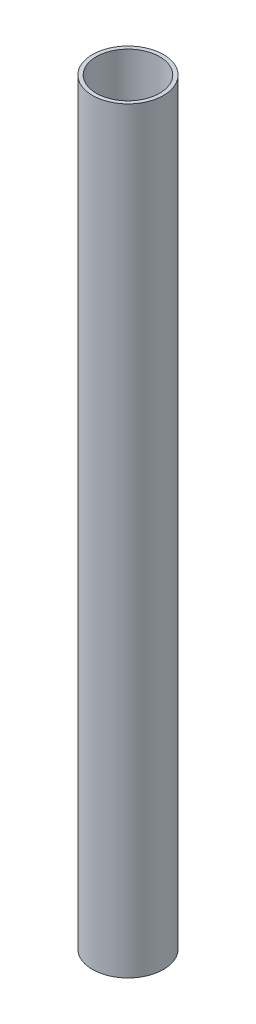
ISO-10303-21;
HEADER;
FILE_DESCRIPTION(('STEP AP214'),'2;1');
FILE_NAME('part.step','',(''),(''),'','','');
FILE_SCHEMA(('AUTOMOTIVE_DESIGN { 1 0 10303 214 1 1 1 1 }'));
ENDSEC;
DATA;
#1=APPLICATION_CONTEXT('core data for automotive mechanical design processes');
#2=APPLICATION_PROTOCOL_DEFINITION('international standard','automotive_design',2000,#1);
#3=PRODUCT_CONTEXT('',#1,'mechanical');
#4=PRODUCT('Part','Part','',(#3));
#5=PRODUCT_RELATED_PRODUCT_CATEGORY('part','',(#4));
#6=PRODUCT_DEFINITION_FORMATION('','',#4);
#7=PRODUCT_DEFINITION_CONTEXT('part definition',#1,'design');
#8=PRODUCT_DEFINITION('design','',#6,#7);
#9=PRODUCT_DEFINITION_SHAPE('','',#8);
#10=(LENGTH_UNIT() NAMED_UNIT(*) SI_UNIT(.MILLI.,.METRE.));
#11=(NAMED_UNIT(*) PLANE_ANGLE_UNIT() SI_UNIT($,.RADIAN.));
#12=(NAMED_UNIT(*) SI_UNIT($,.STERADIAN.) SOLID_ANGLE_UNIT());
#13=UNCERTAINTY_MEASURE_WITH_UNIT(LENGTH_MEASURE(1.E-05),#10,'distance_accuracy_value','');
#14=(GEOMETRIC_REPRESENTATION_CONTEXT(3) GLOBAL_UNCERTAINTY_ASSIGNED_CONTEXT((#13)) GLOBAL_UNIT_ASSIGNED_CONTEXT((#10,
#11,#12)) REPRESENTATION_CONTEXT('',''));
#15=CARTESIAN_POINT('',(0.,0.,0.));
#16=DIRECTION('',(0.,0.,1.));
#17=DIRECTION('',(1.,0.,0.));
#18=AXIS2_PLACEMENT_3D('',#15,#16,#17);
#19=CARTESIAN_POINT('',(0.,800.,0.));
#20=DIRECTION('',(0.,-1.,0.));
#21=DIRECTION('',(0.,0.,-1.));
#22=AXIS2_PLACEMENT_3D('',#19,#20,#21);
#23=CYLINDRICAL_SURFACE('',#22,33.5);
#24=CARTESIAN_POINT('',(0.,660.,0.));
#25=DIRECTION('',(0.,1.,0.));
#26=DIRECTION('',(0.,0.,1.));
#27=AXIS2_PLACEMENT_3D('',#24,#25,#26);
#28=CIRCLE('',#27,33.5);
#29=CARTESIAN_POINT('',(0.,660.,33.5));
#30=VERTEX_POINT('',#29);
#31=EDGE_CURVE('E10',#30,#30,#28,.T.);
#32=ORIENTED_EDGE('',*,*,#31,.F.);
#33=EDGE_LOOP('',(#32));
#34=FACE_BOUND('',#33,.T.);
#35=CARTESIAN_POINT('',(0.,800.,0.));
#36=DIRECTION('',(0.,1.,0.));
#37=DIRECTION('',(0.,0.,1.));
#38=AXIS2_PLACEMENT_3D('',#35,#36,#37);
#39=CIRCLE('',#38,33.5);
#40=CARTESIAN_POINT('',(0.,800.,33.5));
#41=VERTEX_POINT('',#40);
#42=EDGE_CURVE('E68',#41,#41,#39,.T.);
#43=ORIENTED_EDGE('',*,*,#42,.T.);
#44=EDGE_LOOP('',(#43));
#45=FACE_BOUND('',#44,.T.);
#46=ADVANCED_FACE('F45',(#34,#45),#23,.F.);
#47=CARTESIAN_POINT('',(0.,800.,0.));
#48=DIRECTION('',(0.,1.,0.));
#49=DIRECTION('',(0.,0.,1.));
#50=AXIS2_PLACEMENT_3D('',#47,#48,#49);
#51=PLANE('',#50);
#52=CARTESIAN_POINT('',(0.,800.,0.));
#53=DIRECTION('',(0.,1.,0.));
#54=DIRECTION('',(0.,0.,1.));
#55=AXIS2_PLACEMENT_3D('',#52,#53,#54);
#56=CIRCLE('',#55,37.5);
#57=CARTESIAN_POINT('',(0.,800.,37.5));
#58=VERTEX_POINT('',#57);
#59=EDGE_CURVE('E58',#58,#58,#56,.T.);
#60=ORIENTED_EDGE('',*,*,#59,.T.);
#61=EDGE_LOOP('',(#60));
#62=FACE_BOUND('',#61,.T.);
#63=ORIENTED_EDGE('',*,*,#42,.F.);
#64=EDGE_LOOP('',(#63));
#65=FACE_BOUND('',#64,.T.);
#66=ADVANCED_FACE('F96',(#62,#65),#51,.T.);
#67=CARTESIAN_POINT('',(0.,0.,0.));
#68=DIRECTION('',(0.,1.,0.));
#69=DIRECTION('',(0.,0.,1.));
#70=AXIS2_PLACEMENT_3D('',#67,#68,#69);
#71=PLANE('',#70);
#72=CARTESIAN_POINT('',(0.,0.,0.));
#73=DIRECTION('',(0.,1.,0.));
#74=DIRECTION('',(0.,0.,1.));
#75=AXIS2_PLACEMENT_3D('',#72,#73,#74);
#76=CIRCLE('',#75,37.5);
#77=CARTESIAN_POINT('',(0.,0.,37.5));
#78=VERTEX_POINT('',#77);
#79=EDGE_CURVE('E63',#78,#78,#76,.T.);
#80=ORIENTED_EDGE('',*,*,#79,.F.);
#81=EDGE_LOOP('',(#80));
#82=FACE_BOUND('',#81,.T.);
#83=CARTESIAN_POINT('',(0.,0.,0.));
#84=DIRECTION('',(0.,1.,0.));
#85=DIRECTION('',(0.,0.,1.));
#86=AXIS2_PLACEMENT_3D('',#83,#84,#85);
#87=CIRCLE('',#86,33.5);
#88=CARTESIAN_POINT('',(0.,0.,33.5));
#89=VERTEX_POINT('',#88);
#90=EDGE_CURVE('E70',#89,#89,#87,.T.);
#91=ORIENTED_EDGE('',*,*,#90,.T.);
#92=EDGE_LOOP('',(#91));
#93=FACE_BOUND('',#92,.T.);
#94=ADVANCED_FACE('F101',(#82,#93),#71,.F.);
#95=CARTESIAN_POINT('',(0.,800.,0.));
#96=DIRECTION('',(0.,-1.,0.));
#97=DIRECTION('',(0.,0.,-1.));
#98=AXIS2_PLACEMENT_3D('',#95,#96,#97);
#99=CYLINDRICAL_SURFACE('',#98,37.5);
#100=ORIENTED_EDGE('',*,*,#59,.F.);
#101=EDGE_LOOP('',(#100));
#102=FACE_BOUND('',#101,.T.);
#103=ORIENTED_EDGE('',*,*,#79,.T.);
#104=EDGE_LOOP('',(#103));
#105=FACE_BOUND('',#104,.T.);
#106=ADVANCED_FACE('F47',(#102,#105),#99,.T.);
#107=CARTESIAN_POINT('',(0.,650.,0.));
#108=DIRECTION('',(0.,-1.,0.));
#109=DIRECTION('',(0.,0.,-1.));
#110=AXIS2_PLACEMENT_3D('',#107,#108,#109);
#111=CIRCLE('',#110,33.5);
#112=CARTESIAN_POINT('',(0.,650.,-33.5));
#113=VERTEX_POINT('',#112);
#114=EDGE_CURVE('E53',#113,#113,#111,.T.);
#115=ORIENTED_EDGE('',*,*,#114,.F.);
#116=EDGE_LOOP('',(#115));
#117=FACE_BOUND('',#116,.T.);
#118=ORIENTED_EDGE('',*,*,#90,.F.);
#119=EDGE_LOOP('',(#118));
#120=FACE_BOUND('',#119,.T.);
#121=ADVANCED_FACE('F86',(#117,#120),#23,.F.);
#122=CARTESIAN_POINT('',(0.,660.,30.5));
#123=DIRECTION('',(0.,1.,0.));
#124=DIRECTION('',(0.,0.,1.));
#125=AXIS2_PLACEMENT_3D('',#122,#123,#124);
#126=PLANE('',#125);
#127=ORIENTED_EDGE('',*,*,#31,.T.);
#128=EDGE_LOOP('',(#127));
#129=FACE_BOUND('',#128,.T.);
#130=CARTESIAN_POINT('',(0.,660.,0.));
#131=DIRECTION('',(0.,1.,0.));
#132=DIRECTION('',(0.,0.,1.));
#133=AXIS2_PLACEMENT_3D('',#130,#131,#132);
#134=CIRCLE('',#133,30.5);
#135=CARTESIAN_POINT('',(0.,660.,30.5));
#136=VERTEX_POINT('',#135);
#137=EDGE_CURVE('E74',#136,#136,#134,.T.);
#138=ORIENTED_EDGE('',*,*,#137,.F.);
#139=EDGE_LOOP('',(#138));
#140=FACE_BOUND('',#139,.T.);
#141=ADVANCED_FACE('F84',(#129,#140),#126,.T.);
#142=CARTESIAN_POINT('',(0.,650.,0.));
#143=DIRECTION('',(0.,-1.,0.));
#144=DIRECTION('',(0.,0.,-1.));
#145=AXIS2_PLACEMENT_3D('',#142,#143,#144);
#146=CONICAL_SURFACE('',#145,33.5,0.291456794477865);
#147=ORIENTED_EDGE('',*,*,#137,.T.);
#148=EDGE_LOOP('',(#147));
#149=FACE_BOUND('',#148,.T.);
#150=ORIENTED_EDGE('',*,*,#114,.T.);
#151=EDGE_LOOP('',(#150));
#152=FACE_BOUND('',#151,.T.);
#153=ADVANCED_FACE('F82',(#149,#152),#146,.F.);
#154=CLOSED_SHELL('',(#46,#66,#94,#106,#121,#141,#153));
#155=MANIFOLD_SOLID_BREP('B2',#154);
#156=ADVANCED_BREP_SHAPE_REPRESENTATION('',(#18,#155),#14);
#157=SHAPE_DEFINITION_REPRESENTATION(#9,#156);
ENDSEC;
END-ISO-10303-21;
